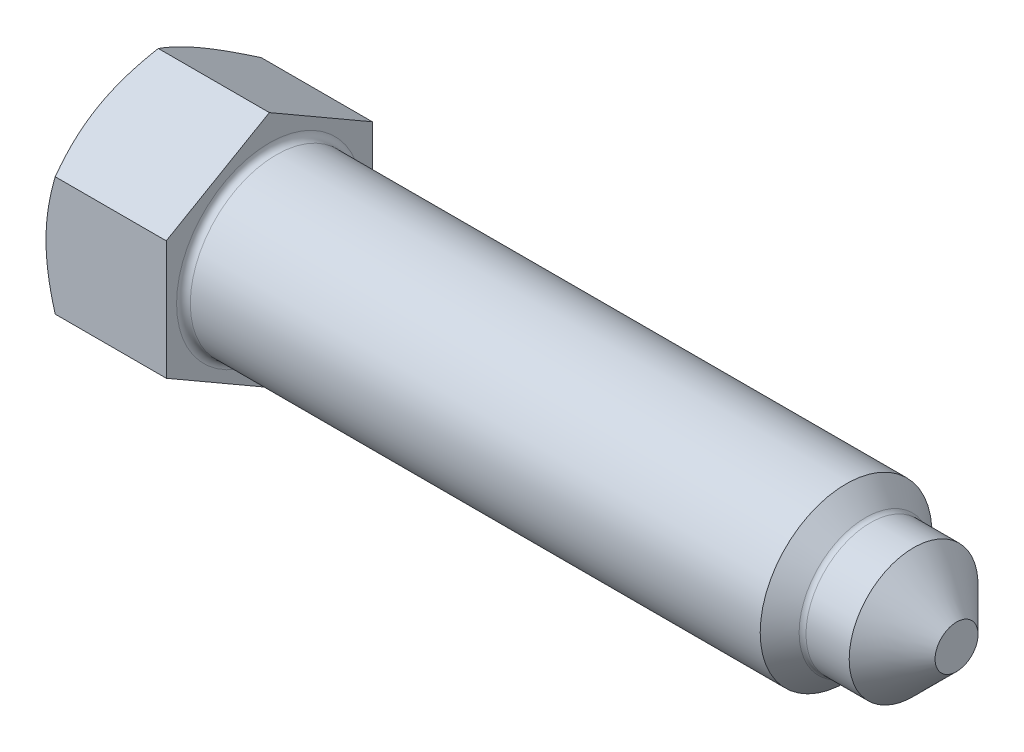
ISO-10303-21;
HEADER;
FILE_DESCRIPTION(('STEP AP214'),'2;1');
FILE_NAME('part.step','',(''),(''),'','','');
FILE_SCHEMA(('AUTOMOTIVE_DESIGN { 1 0 10303 214 1 1 1 1 }'));
ENDSEC;
DATA;
#1=APPLICATION_CONTEXT('core data for automotive mechanical design processes');
#2=APPLICATION_PROTOCOL_DEFINITION('international standard','automotive_design',2000,#1);
#3=PRODUCT_CONTEXT('',#1,'mechanical');
#4=PRODUCT('Part','Part','',(#3));
#5=PRODUCT_RELATED_PRODUCT_CATEGORY('part','',(#4));
#6=PRODUCT_DEFINITION_FORMATION('','',#4);
#7=PRODUCT_DEFINITION_CONTEXT('part definition',#1,'design');
#8=PRODUCT_DEFINITION('design','',#6,#7);
#9=PRODUCT_DEFINITION_SHAPE('','',#8);
#10=(LENGTH_UNIT() NAMED_UNIT(*) SI_UNIT(.MILLI.,.METRE.));
#11=(NAMED_UNIT(*) PLANE_ANGLE_UNIT() SI_UNIT($,.RADIAN.));
#12=(NAMED_UNIT(*) SI_UNIT($,.STERADIAN.) SOLID_ANGLE_UNIT());
#13=UNCERTAINTY_MEASURE_WITH_UNIT(LENGTH_MEASURE(1.E-05),#10,'distance_accuracy_value','');
#14=(GEOMETRIC_REPRESENTATION_CONTEXT(3) GLOBAL_UNCERTAINTY_ASSIGNED_CONTEXT((#13)) GLOBAL_UNIT_ASSIGNED_CONTEXT((#10,
#11,#12)) REPRESENTATION_CONTEXT('',''));
#15=CARTESIAN_POINT('',(0.,0.,0.));
#16=DIRECTION('',(0.,0.,1.));
#17=DIRECTION('',(1.,0.,0.));
#18=AXIS2_PLACEMENT_3D('',#15,#16,#17);
#19=CARTESIAN_POINT('',(14.,6.9282032302755,-12.));
#20=DIRECTION('',(0.,-0.866025403784438,0.500000000000001));
#21=DIRECTION('',(0.,-0.500000000000001,-0.866025403784438));
#22=AXIS2_PLACEMENT_3D('',#19,#20,#21);
#23=PLANE('',#22);
#24=CARTESIAN_POINT('',(1.07186343722447,13.8565219306049,0.0002));
#25=CARTESIAN_POINT('',(0.983949632185857,13.7042251307133,-0.263585795242263));
#26=CARTESIAN_POINT('',(0.900025997556664,13.5513604901482,-0.5283551193818));
#27=CARTESIAN_POINT('',(0.741266218872839,13.244405350712,-1.06001701652966));
#28=CARTESIAN_POINT('',(0.666433063673581,13.0903144663124,-1.32691025729307));
#29=CARTESIAN_POINT('',(0.457017539854151,12.6255589607763,-2.13189040597901));
#30=CARTESIAN_POINT('',(0.33790323672285,12.3130596590925,-2.6731550738251));
#31=CARTESIAN_POINT('',(0.198231061003145,11.8454187840152,-3.48313282915499));
#32=CARTESIAN_POINT('',(0.158443797040445,11.6916742921315,-3.74942610048137));
#33=CARTESIAN_POINT('',(0.091723369217091,11.3834734611381,-4.28324559869683));
#34=CARTESIAN_POINT('',(0.0647904527677748,11.2290171083848,-4.55077184921737));
#35=CARTESIAN_POINT('',(0.0244685919169245,10.9198468953819,-5.08627036632534));
#36=CARTESIAN_POINT('',(0.0110635528823167,10.7651335610083,-5.35424172206872));
#37=CARTESIAN_POINT('',(-0.00191690624283409,10.4555635369292,-5.89043273227403));
#38=CARTESIAN_POINT('',(-0.00149275363726694,10.3007068518009,-6.15865237880803));
#39=CARTESIAN_POINT('',(0.0122200193427709,10.011202064883,-6.6600893787841));
#40=CARTESIAN_POINT('',(0.0238359825785288,9.87653331649855,-6.89334249317775));
#41=CARTESIAN_POINT('',(0.0573080088723756,9.60750555673725,-7.35931224173076));
#42=CARTESIAN_POINT('',(0.0791647962662152,9.47314656794543,-7.59202883677176));
#43=CARTESIAN_POINT('',(0.132737416542906,9.20481134519089,-8.05679907604294));
#44=CARTESIAN_POINT('',(0.16446139249292,9.07083551994084,-8.288852012362));
#45=CARTESIAN_POINT('',(0.237211775670436,8.80351197901488,-8.75186996730497));
#46=CARTESIAN_POINT('',(0.278238815183194,8.67016430666066,-8.98283491089354));
#47=CARTESIAN_POINT('',(0.416311653281799,8.2653799638421,-9.68394195876366));
#48=CARTESIAN_POINT('',(0.52712488833932,7.99511549730955,-10.1520537462785));
#49=CARTESIAN_POINT('',(0.778625766937874,7.45861659251288,-11.0812971075914));
#50=CARTESIAN_POINT('',(0.919254342659372,7.19237528499142,-11.5424405792922));
#51=CARTESIAN_POINT('',(1.07186343722446,6.92808776022166,-12.0002));
#52=B_SPLINE_CURVE_WITH_KNOTS('',3,(#24,#25,#26,#27,#28,#29,#30,#31,#32,#33,#34,#35,#36,#37,#38,
#39,#40,#41,#42,#43,#44,#45,#46,#47,#48,#49,#50,#51),.UNSPECIFIED.,.F.,.F.,(4,2,2,2,2,2,2,2,2,2,
2,2,2,4),(0.,0.951004872251244,1.90232158356437,3.80900466161368,4.7389455141357,
5.66890426477609,6.59775529889865,7.5265776327693,8.33514643820578,9.14377244252749,
9.95306755799765,10.7624176939264,12.4167102786892,14.0677556316691),.UNSPECIFIED.);
#53=CARTESIAN_POINT('',(1.07179676972448,13.856406460551,0.));
#54=VERTEX_POINT('',#53);
#55=CARTESIAN_POINT('',(0.,10.3923048454133,-6.00000000000002));
#56=VERTEX_POINT('',#55);
#57=EDGE_CURVE('E47',#54,#56,#52,.T.);
#58=ORIENTED_EDGE('',*,*,#57,.F.);
#59=DIRECTION('',(-1.,0.,0.));
#60=VECTOR('',#59,1.);
#61=CARTESIAN_POINT('',(14.,13.856406460551,0.));
#62=LINE('',#61,#60);
#63=CARTESIAN_POINT('',(14.,13.856406460551,0.));
#64=VERTEX_POINT('',#63);
#65=EDGE_CURVE('E146',#64,#54,#62,.T.);
#66=ORIENTED_EDGE('',*,*,#65,.F.);
#67=DIRECTION('',(0.,0.500000000000001,0.866025403784438));
#68=VECTOR('',#67,1.);
#69=CARTESIAN_POINT('',(14.,6.9282032302755,-12.));
#70=LINE('',#69,#68);
#71=CARTESIAN_POINT('',(14.,6.9282032302755,-12.));
#72=VERTEX_POINT('',#71);
#73=EDGE_CURVE('E306',#72,#64,#70,.T.);
#74=ORIENTED_EDGE('',*,*,#73,.F.);
#75=DIRECTION('',(-1.,0.,0.));
#76=VECTOR('',#75,1.);
#77=CARTESIAN_POINT('',(14.,6.9282032302755,-12.));
#78=LINE('',#77,#76);
#79=CARTESIAN_POINT('',(1.07179676972447,6.9282032302755,-12.));
#80=VERTEX_POINT('',#79);
#81=EDGE_CURVE('E133',#72,#80,#78,.T.);
#82=ORIENTED_EDGE('',*,*,#81,.T.);
#83=EDGE_CURVE('E127',#56,#80,#52,.T.);
#84=ORIENTED_EDGE('',*,*,#83,.F.);
#85=EDGE_LOOP('',(#58,#66,#74,#82,#84));
#86=FACE_BOUND('',#85,.T.);
#87=ADVANCED_FACE('F32',(#86),#23,.F.);
#88=CARTESIAN_POINT('',(14.,13.856406460551,0.));
#89=DIRECTION('',(0.,-0.866025403784439,-0.5));
#90=DIRECTION('',(0.,0.5,-0.866025403784439));
#91=AXIS2_PLACEMENT_3D('',#88,#89,#90);
#92=PLANE('',#91);
#93=CARTESIAN_POINT('',(1.07186343722447,6.92808776022168,12.0002));
#94=CARTESIAN_POINT('',(0.983949632185856,7.0803845601132,11.7364142047577));
#95=CARTESIAN_POINT('',(0.900025997556663,7.23324920067831,11.4716448806182));
#96=CARTESIAN_POINT('',(0.741266218872838,7.5402043401145,10.9399829834703));
#97=CARTESIAN_POINT('',(0.666433063673581,7.69429522451415,10.6730897427069));
#98=CARTESIAN_POINT('',(0.457017539854151,8.15905073005028,9.86810959402099));
#99=CARTESIAN_POINT('',(0.337903236722851,8.47155003173405,9.3268449261749));
#100=CARTESIAN_POINT('',(0.198231061003146,8.93919090681138,8.51686717084501));
#101=CARTESIAN_POINT('',(0.158443797040447,9.09293539869505,8.25057389951863));
#102=CARTESIAN_POINT('',(0.0917233692170934,9.40113622968842,7.71675440130316));
#103=CARTESIAN_POINT('',(0.0647904527677778,9.55559258244174,7.44922815078262));
#104=CARTESIAN_POINT('',(0.024468591916929,9.86476279544467,6.91372963367465));
#105=CARTESIAN_POINT('',(0.0110635528823219,10.0194761298182,6.64575827793128));
#106=CARTESIAN_POINT('',(-0.00191690624282825,10.3290461538973,6.10956726772596));
#107=CARTESIAN_POINT('',(-0.00149275363726122,10.4839028390257,5.84134762119196));
#108=CARTESIAN_POINT('',(0.0122200193427771,10.7734076259435,5.3399106212159));
#109=CARTESIAN_POINT('',(0.0238359825785356,10.908076374328,5.10665750682225));
#110=CARTESIAN_POINT('',(0.057308008872383,11.1771041340893,4.64068775826924));
#111=CARTESIAN_POINT('',(0.0791647962662228,11.3114631228811,4.40797116322823));
#112=CARTESIAN_POINT('',(0.132737416542915,11.5797983456356,3.94320092395706));
#113=CARTESIAN_POINT('',(0.164461392492929,11.7137741708857,3.711147987638));
#114=CARTESIAN_POINT('',(0.237211775670445,11.9810977118116,3.24813003269502));
#115=CARTESIAN_POINT('',(0.278238815183202,12.1144453841659,3.01716508910646));
#116=CARTESIAN_POINT('',(0.416311653281805,12.5192297269844,2.31605804123633));
#117=CARTESIAN_POINT('',(0.527124888339327,12.789494193517,1.84794625372147));
#118=CARTESIAN_POINT('',(0.778625766937884,13.3259930983136,0.91870289240858));
#119=CARTESIAN_POINT('',(0.919254342659383,13.5922344058351,0.457559420707848));
#120=CARTESIAN_POINT('',(1.07186343722447,13.8565219306049,-0.000199999999998182));
#121=B_SPLINE_CURVE_WITH_KNOTS('',3,(#93,#94,#95,#96,#97,#98,#99,#100,#101,#102,#103,#104,#105,
#106,#107,#108,#109,#110,#111,#112,#113,#114,#115,#116,#117,#118,#119,#120),.UNSPECIFIED.,.F.,
.F.,(4,2,2,2,2,2,2,2,2,2,2,2,2,4),(0.,0.951004872251244,1.90232158356437,3.80900466161368,
4.7389455141357,5.66890426477609,6.59775529889865,7.5265776327693,8.33514643820578,
9.14377244252749,9.95306755799765,10.7624176939264,12.4167102786892,14.0677556316691),.UNSPECIFIED.);
#122=CARTESIAN_POINT('',(1.07179676972448,6.92820323027552,12.));
#123=VERTEX_POINT('',#122);
#124=CARTESIAN_POINT('',(0.,10.3923048454133,6.));
#125=VERTEX_POINT('',#124);
#126=EDGE_CURVE('E55',#123,#125,#121,.T.);
#127=ORIENTED_EDGE('',*,*,#126,.F.);
#128=DIRECTION('',(-1.,0.,0.));
#129=VECTOR('',#128,1.);
#130=CARTESIAN_POINT('',(14.,6.92820323027552,12.));
#131=LINE('',#130,#129);
#132=CARTESIAN_POINT('',(14.,6.92820323027552,12.));
#133=VERTEX_POINT('',#132);
#134=EDGE_CURVE('E143',#133,#123,#131,.T.);
#135=ORIENTED_EDGE('',*,*,#134,.F.);
#136=DIRECTION('',(0.,-0.5,0.866025403784439));
#137=VECTOR('',#136,1.);
#138=CARTESIAN_POINT('',(14.,13.856406460551,0.));
#139=LINE('',#138,#137);
#140=EDGE_CURVE('E292',#64,#133,#139,.T.);
#141=ORIENTED_EDGE('',*,*,#140,.F.);
#142=ORIENTED_EDGE('',*,*,#65,.T.);
#143=EDGE_CURVE('E221',#125,#54,#121,.T.);
#144=ORIENTED_EDGE('',*,*,#143,.F.);
#145=EDGE_LOOP('',(#127,#135,#141,#142,#144));
#146=FACE_BOUND('',#145,.T.);
#147=ADVANCED_FACE('F173',(#146),#92,.F.);
#148=CARTESIAN_POINT('',(14.,6.92820323027552,12.));
#149=DIRECTION('',(0.,0.,-1.));
#150=DIRECTION('',(-1.,0.,0.));
#151=AXIS2_PLACEMENT_3D('',#148,#149,#150);
#152=PLANE('',#151);
#153=CARTESIAN_POINT('',(5.93796522499153,-18.7780422876809,12.));
#154=CARTESIAN_POINT('',(5.81013580153164,-18.5152821742341,12.));
#155=CARTESIAN_POINT('',(5.68293119845558,-18.2522182359297,12.));
#156=CARTESIAN_POINT('',(5.4299128141003,-17.7254193681017,12.));
#157=CARTESIAN_POINT('',(5.30409904630049,-17.4616844321054,12.));
#158=CARTESIAN_POINT('',(4.92892368290869,-16.6693101743881,12.));
#159=CARTESIAN_POINT('',(4.68186469152989,-16.1395765656331,12.));
#160=CARTESIAN_POINT('',(4.19405479952977,-15.0738169190077,12.));
#161=CARTESIAN_POINT('',(3.95334413341021,-14.5377724221017,12.));
#162=CARTESIAN_POINT('',(3.48154718674619,-13.461479060208,12.));
#163=CARTESIAN_POINT('',(3.25046046260961,-12.9212303903669,12.));
#164=CARTESIAN_POINT('',(2.79294900667125,-11.8175688689819,12.));
#165=CARTESIAN_POINT('',(2.56693655895498,-11.2539842320577,12.));
#166=CARTESIAN_POINT('',(2.1316128327316,-10.1202797331247,12.));
#167=CARTESIAN_POINT('',(1.92230340506568,-9.55015915485904,12.));
#168=CARTESIAN_POINT('',(1.52576124918551,-8.40350794466344,12.));
#169=CARTESIAN_POINT('',(1.33848523718243,-7.82699240007885,12.));
#170=CARTESIAN_POINT('',(0.991896700180043,-6.66563869600159,12.));
#171=CARTESIAN_POINT('',(0.832575542892151,-6.08080316618916,12.));
#172=CARTESIAN_POINT('',(0.620681197025559,-5.19882791551968,12.));
#173=CARTESIAN_POINT('',(0.554713150855279,-4.90488790342144,12.));
#174=CARTESIAN_POINT('',(0.432574422995972,-4.31496880701139,12.));
#175=CARTESIAN_POINT('',(0.376403548449431,-4.01898976295722,12.));
#176=CARTESIAN_POINT('',(0.274840044165102,-3.42518449183523,12.));
#177=CARTESIAN_POINT('',(0.229447213467058,-3.12735829931438,12.));
#178=CARTESIAN_POINT('',(0.150338666864209,-2.5301603353483,12.));
#179=CARTESIAN_POINT('',(0.116622484244824,-2.23078862616277,12.));
#180=CARTESIAN_POINT('',(0.0619693201283194,-1.63489952034462,12.));
#181=CARTESIAN_POINT('',(0.0408679219512408,-1.33839729705373,12.));
#182=CARTESIAN_POINT('',(0.011231051902193,-0.744766224338106,12.));
#183=CARTESIAN_POINT('',(0.00269536679662676,-0.447637385632403,12.));
#184=CARTESIAN_POINT('',(-0.00160621157202279,0.146715096942947,12.));
#185=CARTESIAN_POINT('',(0.00262788821472256,0.443938740760907,12.));
#186=CARTESIAN_POINT('',(0.0237602868313385,1.03793867900078,12.));
#187=CARTESIAN_POINT('',(0.0406591751133814,1.33471495195668,12.));
#188=CARTESIAN_POINT('',(0.0957363037225956,2.04293812544913,12.));
#189=CARTESIAN_POINT('',(0.139644388869436,2.45394931182507,12.));
#190=CARTESIAN_POINT('',(0.249393763135937,3.27301119833397,12.));
#191=CARTESIAN_POINT('',(0.315237895547365,3.68106150767662,12.));
#192=CARTESIAN_POINT('',(0.542190666924397,4.90025554060109,12.));
#193=CARTESIAN_POINT('',(0.732681274216213,5.70600726238714,12.));
#194=CARTESIAN_POINT('',(1.06415793334629,6.9110176011861,12.));
#195=CARTESIAN_POINT('',(1.18384338751809,7.31649624625241,12.));
#196=CARTESIAN_POINT('',(1.43593551476423,8.12351840181158,12.));
#197=CARTESIAN_POINT('',(1.56834227450982,8.52506188547334,12.));
#198=CARTESIAN_POINT('',(1.84372865812762,9.32433402651673,12.));
#199=CARTESIAN_POINT('',(1.98670500371922,9.72206382387904,12.));
#200=CARTESIAN_POINT('',(2.28151949374366,10.514209106185,12.));
#201=CARTESIAN_POINT('',(2.43335751674012,10.9086246364612,12.));
#202=CARTESIAN_POINT('',(2.81137815071348,11.8636440545742,12.));
#203=CARTESIAN_POINT('',(3.04143185567878,12.4227131308579,12.));
#204=CARTESIAN_POINT('',(3.51333410611207,13.5358669332654,12.));
#205=CARTESIAN_POINT('',(3.75518348678293,14.0899513031432,12.));
#206=CARTESIAN_POINT('',(4.24823475653158,15.1941025186568,12.));
#207=CARTESIAN_POINT('',(4.49943904043689,15.7441682918316,12.));
#208=CARTESIAN_POINT('',(5.00924552887372,16.840834953602,12.));
#209=CARTESIAN_POINT('',(5.26784754956298,17.38743592789,12.));
#210=CARTESIAN_POINT('',(5.79133879928481,18.4784293923003,12.));
#211=CARTESIAN_POINT('',(6.05623527465221,19.0228183989983,12.));
#212=CARTESIAN_POINT('',(6.59090796254076,20.1091945794084,12.));
#213=CARTESIAN_POINT('',(6.86068419945744,20.651181741096,12.));
#214=CARTESIAN_POINT('',(7.40421496208663,21.7330545936329,12.));
#215=CARTESIAN_POINT('',(7.67796889125698,22.2729405845112,12.));
#216=CARTESIAN_POINT('',(8.22882461462081,23.351002874205,12.));
#217=CARTESIAN_POINT('',(8.50592642242825,23.8891791660569,12.));
#218=CARTESIAN_POINT('',(9.29226596146121,25.4066579940568,12.));
#219=CARTESIAN_POINT('',(9.8047565962353,26.3842748096139,12.));
#220=CARTESIAN_POINT('',(10.8366490575023,28.3358962609435,12.));
#221=CARTESIAN_POINT('',(11.3560511647271,29.3099007479223,12.));
#222=CARTESIAN_POINT('',(12.3986980712295,31.2524398572293,12.));
#223=CARTESIAN_POINT('',(12.9219285874181,32.2209821512088,12.));
#224=CARTESIAN_POINT('',(13.709817261168,33.6721037842398,12.));
#225=CARTESIAN_POINT('',(13.9729461083085,34.1555146940214,12.));
#226=CARTESIAN_POINT('',(14.5001155834575,35.1218381868037,12.));
#227=CARTESIAN_POINT('',(14.7641562100751,35.6047507705632,12.));
#228=CARTESIAN_POINT('',(15.0285993289472,36.087442911269,12.));
#229=B_SPLINE_CURVE_WITH_KNOTS('',3,(#153,#154,#155,#156,#157,#158,#159,#160,#161,#162,#163,
#164,#165,#166,#167,#168,#169,#170,#171,#172,#173,#174,#175,#176,#177,#178,#179,#180,#181,#182,
#183,#184,#185,#186,#187,#188,#189,#190,#191,#192,#193,#194,#195,#196,#197,#198,#199,#200,#201,
#202,#203,#204,#205,#206,#207,#208,#209,#210,#211,#212,#213,#214,#215,#216,#217,#218,#219,#220,
#221,#222,#223,#224,#225,#226,#227,#228),.UNSPECIFIED.,.F.,.F.,(4,2,2,2,2,2,2,2,2,2,2,2,2,2,2,2,
2,2,2,2,2,2,2,2,2,2,2,2,2,2,2,2,2,2,2,2,2,4),(0.,0.876610778943412,1.75323004620523,
3.50671945197806,5.26947518067904,7.03214956933032,8.85359042595664,10.6752328347611,
12.4932347351832,14.3106742559303,15.2142921518805,16.117892258087,17.0214755150421,
17.9250226516858,18.8165208716869,19.7080039632538,20.5994865696161,21.4910106704728,
22.7303633484054,23.9698767304575,26.4502079763428,27.7184187234137,28.9866381115162,
30.2544657836992,31.5222760862276,33.3357454112636,35.1493433274816,36.9634087547281,
38.7774291394607,40.5936500751824,42.4098800933003,44.2258404831105,46.0418082599001,
49.3531754129826,52.664677481008,55.9671781132062,57.6183303465534,59.2694800621133),.UNSPECIFIED.);
#230=CARTESIAN_POINT('',(1.07179676972447,-6.92820323027549,12.));
#231=VERTEX_POINT('',#230);
#232=CARTESIAN_POINT('',(0.,0.,12.));
#233=VERTEX_POINT('',#232);
#234=EDGE_CURVE('E230',#231,#233,#229,.T.);
#235=ORIENTED_EDGE('',*,*,#234,.F.);
#236=DIRECTION('',(-1.,0.,0.));
#237=VECTOR('',#236,1.);
#238=CARTESIAN_POINT('',(14.,-6.92820323027549,12.));
#239=LINE('',#238,#237);
#240=CARTESIAN_POINT('',(14.,-6.92820323027549,12.));
#241=VERTEX_POINT('',#240);
#242=EDGE_CURVE('E135',#241,#231,#239,.T.);
#243=ORIENTED_EDGE('',*,*,#242,.F.);
#244=DIRECTION('',(0.,-1.,0.));
#245=VECTOR('',#244,1.);
#246=CARTESIAN_POINT('',(14.,6.92820323027552,12.));
#247=LINE('',#246,#245);
#248=EDGE_CURVE('E291',#133,#241,#247,.T.);
#249=ORIENTED_EDGE('',*,*,#248,.F.);
#250=ORIENTED_EDGE('',*,*,#134,.T.);
#251=EDGE_CURVE('E225',#233,#123,#229,.T.);
#252=ORIENTED_EDGE('',*,*,#251,.F.);
#253=EDGE_LOOP('',(#235,#243,#249,#250,#252));
#254=FACE_BOUND('',#253,.T.);
#255=ADVANCED_FACE('F179',(#254),#152,.F.);
#256=CARTESIAN_POINT('',(14.,-13.856406460551,0.));
#257=DIRECTION('',(0.,0.866025403784437,-0.500000000000002));
#258=DIRECTION('',(0.,0.500000000000002,0.866025403784437));
#259=AXIS2_PLACEMENT_3D('',#256,#257,#258);
#260=PLANE('',#259);
#261=CARTESIAN_POINT('',(1.07186343722448,-13.8565219306049,-0.000200000000000038));
#262=CARTESIAN_POINT('',(0.983949632185864,-13.7042251307134,0.263585795242262));
#263=CARTESIAN_POINT('',(0.900025997556671,-13.5513604901482,0.528355119381799));
#264=CARTESIAN_POINT('',(0.741266218872846,-13.2444053507121,1.06001701652966));
#265=CARTESIAN_POINT('',(0.666433063673588,-13.0903144663124,1.32691025729307));
#266=CARTESIAN_POINT('',(0.457017539854158,-12.6255589607763,2.13189040597901));
#267=CARTESIAN_POINT('',(0.337903236722855,-12.3130596590925,2.6731550738251));
#268=CARTESIAN_POINT('',(0.198231061003148,-11.8454187840152,3.48313282915499));
#269=CARTESIAN_POINT('',(0.158443797040449,-11.6916742921315,3.74942610048137));
#270=CARTESIAN_POINT('',(0.0917233692170945,-11.3834734611381,4.28324559869684));
#271=CARTESIAN_POINT('',(0.0647904527677789,-11.2290171083848,4.55077184921738));
#272=CARTESIAN_POINT('',(0.0244685919169284,-10.9198468953819,5.08627036632535));
#273=CARTESIAN_POINT('',(0.0110635528823198,-10.7651335610083,5.35424172206872));
#274=CARTESIAN_POINT('',(-0.00191690624283167,-10.4555635369292,5.89043273227403));
#275=CARTESIAN_POINT('',(-0.0014927536372644,-10.3007068518009,6.15865237880803));
#276=CARTESIAN_POINT('',(0.0122200193427734,-10.0112020648831,6.6600893787841));
#277=CARTESIAN_POINT('',(0.0238359825785312,-9.87653331649856,6.89334249317775));
#278=CARTESIAN_POINT('',(0.0573080088723783,-9.60750555673725,7.35931224173077));
#279=CARTESIAN_POINT('',(0.0791647962662184,-9.47314656794544,7.59202883677177));
#280=CARTESIAN_POINT('',(0.132737416542909,-9.2048113451909,8.05679907604294));
#281=CARTESIAN_POINT('',(0.164461392492923,-9.07083551994084,8.288852012362));
#282=CARTESIAN_POINT('',(0.237211775670439,-8.80351197901488,8.75186996730498));
#283=CARTESIAN_POINT('',(0.278238815183195,-8.67016430666066,8.98283491089354));
#284=CARTESIAN_POINT('',(0.416311653281799,-8.2653799638421,9.68394195876367));
#285=CARTESIAN_POINT('',(0.52712488833932,-7.99511549730955,10.1520537462785));
#286=CARTESIAN_POINT('',(0.778625766937875,-7.45861659251288,11.0812971075914));
#287=CARTESIAN_POINT('',(0.919254342659373,-7.19237528499142,11.5424405792922));
#288=CARTESIAN_POINT('',(1.07186343722446,-6.92808776022166,12.0002));
#289=B_SPLINE_CURVE_WITH_KNOTS('',3,(#261,#262,#263,#264,#265,#266,#267,#268,#269,#270,#271,
#272,#273,#274,#275,#276,#277,#278,#279,#280,#281,#282,#283,#284,#285,#286,#287,#288),
.UNSPECIFIED.,.F.,.F.,(4,2,2,2,2,2,2,2,2,2,2,2,2,4),(0.,0.951004872251247,1.90232158356438,
3.80900466161369,4.7389455141357,5.66890426477609,6.59775529889866,7.52657763276931,
8.33514643820579,9.1437724425275,9.95306755799766,10.7624176939264,12.4167102786892,
14.0677556316691),.UNSPECIFIED.);
#290=CARTESIAN_POINT('',(1.07179676972449,-13.856406460551,0.));
#291=VERTEX_POINT('',#290);
#292=CARTESIAN_POINT('',(0.,-10.3923048454132,6.00000000000002));
#293=VERTEX_POINT('',#292);
#294=EDGE_CURVE('E195',#291,#293,#289,.T.);
#295=ORIENTED_EDGE('',*,*,#294,.F.);
#296=DIRECTION('',(-1.,0.,0.));
#297=VECTOR('',#296,1.);
#298=CARTESIAN_POINT('',(14.,-13.856406460551,0.));
#299=LINE('',#298,#297);
#300=CARTESIAN_POINT('',(14.,-13.856406460551,0.));
#301=VERTEX_POINT('',#300);
#302=EDGE_CURVE('E132',#301,#291,#299,.T.);
#303=ORIENTED_EDGE('',*,*,#302,.F.);
#304=DIRECTION('',(0.,-0.500000000000002,-0.866025403784437));
#305=VECTOR('',#304,1.);
#306=CARTESIAN_POINT('',(14.,-13.856406460551,0.));
#307=LINE('',#306,#305);
#308=EDGE_CURVE('E300',#241,#301,#307,.T.);
#309=ORIENTED_EDGE('',*,*,#308,.F.);
#310=ORIENTED_EDGE('',*,*,#242,.T.);
#311=EDGE_CURVE('E231',#293,#231,#289,.T.);
#312=ORIENTED_EDGE('',*,*,#311,.F.);
#313=EDGE_LOOP('',(#295,#303,#309,#310,#312));
#314=FACE_BOUND('',#313,.T.);
#315=ADVANCED_FACE('F236',(#314),#260,.F.);
#316=CARTESIAN_POINT('',(14.,-6.92820323027553,-12.));
#317=DIRECTION('',(0.,0.866025403784438,0.5));
#318=DIRECTION('',(0.,-0.5,0.866025403784439));
#319=AXIS2_PLACEMENT_3D('',#316,#317,#318);
#320=PLANE('',#319);
#321=CARTESIAN_POINT('',(1.07186343722447,-6.92808776022169,-12.0002));
#322=CARTESIAN_POINT('',(0.983949632185859,-7.08038456011321,-11.7364142047577));
#323=CARTESIAN_POINT('',(0.900025997556666,-7.23324920067832,-11.4716448806182));
#324=CARTESIAN_POINT('',(0.741266218872841,-7.54020434011451,-10.9399829834703));
#325=CARTESIAN_POINT('',(0.666433063673584,-7.69429522451416,-10.6730897427069));
#326=CARTESIAN_POINT('',(0.457017539854154,-8.15905073005029,-9.86810959402099));
#327=CARTESIAN_POINT('',(0.337903236722854,-8.47155003173406,-9.3268449261749));
#328=CARTESIAN_POINT('',(0.198231061003151,-8.93919090681139,-8.516867170845));
#329=CARTESIAN_POINT('',(0.158443797040452,-9.09293539869506,-8.25057389951863));
#330=CARTESIAN_POINT('',(0.0917233692170985,-9.40113622968843,-7.71675440130316));
#331=CARTESIAN_POINT('',(0.0647904527677828,-9.55559258244175,-7.44922815078262));
#332=CARTESIAN_POINT('',(0.024468591916934,-9.86476279544469,-6.91372963367465));
#333=CARTESIAN_POINT('',(0.011063552882327,-10.0194761298182,-6.64575827793127));
#334=CARTESIAN_POINT('',(-0.00191690624282283,-10.3290461538973,-6.10956726772596));
#335=CARTESIAN_POINT('',(-0.00149275363725555,-10.4839028390257,-5.84134762119196));
#336=CARTESIAN_POINT('',(0.0122200193427835,-10.7734076259435,-5.3399106212159));
#337=CARTESIAN_POINT('',(0.0238359825785423,-10.908076374328,-5.10665750682225));
#338=CARTESIAN_POINT('',(0.0573080088723902,-11.1771041340893,-4.64068775826923));
#339=CARTESIAN_POINT('',(0.07916479626623,-11.3114631228811,-4.40797116322823));
#340=CARTESIAN_POINT('',(0.132737416542921,-11.5797983456357,-3.94320092395706));
#341=CARTESIAN_POINT('',(0.164461392492935,-11.7137741708857,-3.711147987638));
#342=CARTESIAN_POINT('',(0.237211775670452,-11.9810977118117,-3.24813003269502));
#343=CARTESIAN_POINT('',(0.278238815183209,-12.1144453841659,-3.01716508910646));
#344=CARTESIAN_POINT('',(0.416311653281813,-12.5192297269844,-2.31605804123633));
#345=CARTESIAN_POINT('',(0.527124888339336,-12.789494193517,-1.84794625372147));
#346=CARTESIAN_POINT('',(0.778625766937892,-13.3259930983137,-0.918702892408578));
#347=CARTESIAN_POINT('',(0.91925434265939,-13.5922344058351,-0.457559420707847));
#348=CARTESIAN_POINT('',(1.07186343722448,-13.8565219306049,0.000199999999998666));
#349=B_SPLINE_CURVE_WITH_KNOTS('',3,(#321,#322,#323,#324,#325,#326,#327,#328,#329,#330,#331,
#332,#333,#334,#335,#336,#337,#338,#339,#340,#341,#342,#343,#344,#345,#346,#347,#348),
.UNSPECIFIED.,.F.,.F.,(4,2,2,2,2,2,2,2,2,2,2,2,2,4),(0.,0.951004872251244,1.90232158356437,
3.80900466161368,4.7389455141357,5.66890426477609,6.59775529889865,7.5265776327693,
8.33514643820578,9.14377244252749,9.95306755799765,10.7624176939264,12.4167102786892,
14.0677556316691),.UNSPECIFIED.);
#350=CARTESIAN_POINT('',(1.07179676972448,-6.92820323027553,-12.));
#351=VERTEX_POINT('',#350);
#352=CARTESIAN_POINT('',(0.,-10.3923048454133,-6.));
#353=VERTEX_POINT('',#352);
#354=EDGE_CURVE('E108',#351,#353,#349,.T.);
#355=ORIENTED_EDGE('',*,*,#354,.F.);
#356=DIRECTION('',(-1.,0.,0.));
#357=VECTOR('',#356,1.);
#358=CARTESIAN_POINT('',(14.,-6.92820323027553,-12.));
#359=LINE('',#358,#357);
#360=CARTESIAN_POINT('',(14.,-6.92820323027553,-12.));
#361=VERTEX_POINT('',#360);
#362=EDGE_CURVE('E123',#361,#351,#359,.T.);
#363=ORIENTED_EDGE('',*,*,#362,.F.);
#364=DIRECTION('',(0.,0.5,-0.866025403784439));
#365=VECTOR('',#364,1.);
#366=CARTESIAN_POINT('',(14.,-6.92820323027553,-12.));
#367=LINE('',#366,#365);
#368=EDGE_CURVE('E298',#301,#361,#367,.T.);
#369=ORIENTED_EDGE('',*,*,#368,.F.);
#370=ORIENTED_EDGE('',*,*,#302,.T.);
#371=EDGE_CURVE('E126',#353,#291,#349,.T.);
#372=ORIENTED_EDGE('',*,*,#371,.F.);
#373=EDGE_LOOP('',(#355,#363,#369,#370,#372));
#374=FACE_BOUND('',#373,.T.);
#375=ADVANCED_FACE('F121',(#374),#320,.F.);
#376=CARTESIAN_POINT('',(14.,6.9282032302755,-12.));
#377=DIRECTION('',(0.,0.,1.));
#378=DIRECTION('',(0.,-1.,0.));
#379=AXIS2_PLACEMENT_3D('',#376,#377,#378);
#380=PLANE('',#379);
#381=CARTESIAN_POINT('',(5.93796522688048,-18.7780422915637,-12.));
#382=CARTESIAN_POINT('',(5.81013580338117,-18.5152821780516,-12.));
#383=CARTESIAN_POINT('',(5.68293120026572,-18.2522182396819,-12.));
#384=CARTESIAN_POINT('',(5.42991281583172,-17.7254193717232,-12.));
#385=CARTESIAN_POINT('',(5.30409904799258,-17.4616844356616,-12.));
#386=CARTESIAN_POINT('',(4.92892368448291,-16.669310177748,-12.));
#387=CARTESIAN_POINT('',(4.68186469302572,-16.139576568862,-12.));
#388=CARTESIAN_POINT('',(4.19405480086876,-15.0738169219725,-12.));
#389=CARTESIAN_POINT('',(3.95334413467078,-14.5377724249334,-12.));
#390=CARTESIAN_POINT('',(3.48154718785119,-13.4614790627728,-12.));
#391=CARTESIAN_POINT('',(3.25046046363748,-12.9212303927976,-12.));
#392=CARTESIAN_POINT('',(2.7929490075426,-11.8175688711343,-12.));
#393=CARTESIAN_POINT('',(2.56693655974712,-11.2539842340656,-12.));
#394=CARTESIAN_POINT('',(2.13161283336956,-10.1202797348412,-12.));
#395=CARTESIAN_POINT('',(1.92230340562866,-9.55015915642869,-12.));
#396=CARTESIAN_POINT('',(1.52576124960571,-8.40350794593667,-12.));
#397=CARTESIAN_POINT('',(1.33848523753482,-7.82699240120253,-12.));
#398=CARTESIAN_POINT('',(0.991896700407868,-6.66563869682203,-12.));
#399=CARTESIAN_POINT('',(0.83257554306322,-6.08080316685593,-12.));
#400=CARTESIAN_POINT('',(0.620681197115221,-5.19882791591538,-12.));
#401=CARTESIAN_POINT('',(0.554713150915097,-4.90488790370126,-12.));
#402=CARTESIAN_POINT('',(0.432574423003697,-4.3149688070578,-12.));
#403=CARTESIAN_POINT('',(0.376403548434908,-4.01898976288609,-12.));
#404=CARTESIAN_POINT('',(0.274840044114867,-3.42518449152774,-12.));
#405=CARTESIAN_POINT('',(0.229447213403355,-3.12735829888806,-12.));
#406=CARTESIAN_POINT('',(0.150338666783349,-2.53016033468332,-12.));
#407=CARTESIAN_POINT('',(0.116622484160274,-2.23078862537795,-12.));
#408=CARTESIAN_POINT('',(0.0619693200469847,-1.63489951932263,-12.));
#409=CARTESIAN_POINT('',(0.040867921876617,-1.33839729591442,-12.));
#410=CARTESIAN_POINT('',(0.0112310518513523,-0.744766222964399,-12.));
#411=CARTESIAN_POINT('',(0.00269536676285804,-0.447637384141611,-12.));
#412=CARTESIAN_POINT('',(-0.00160621156152653,0.146715098667033,-12.));
#413=CARTESIAN_POINT('',(0.00262788825241379,0.443938742601202,-12.));
#414=CARTESIAN_POINT('',(0.0237602869328196,1.03793868107198,-12.));
#415=CARTESIAN_POINT('',(0.0406591752514585,1.33471495414257,-12.));
#416=CARTESIAN_POINT('',(0.0957363039506862,2.04293812781233,-12.));
#417=CARTESIAN_POINT('',(0.139644389149357,2.45394931425036,-12.));
#418=CARTESIAN_POINT('',(0.249393763522293,3.27301120088065,-12.));
#419=CARTESIAN_POINT('',(0.315237895988329,3.68106151028259,-12.));
#420=CARTESIAN_POINT('',(0.542190667530327,4.90025554338171,-12.));
#421=CARTESIAN_POINT('',(0.732681274933577,5.70600726527964,-12.));
#422=CARTESIAN_POINT('',(1.06415793422806,6.91101760424588,-12.));
#423=CARTESIAN_POINT('',(1.18384338845501,7.3164962493691,-12.));
#424=CARTESIAN_POINT('',(1.43593551580978,8.12351840504145,-12.));
#425=CARTESIAN_POINT('',(1.56834227560885,8.52506188875948,-12.));
#426=CARTESIAN_POINT('',(1.8437286593317,9.32433402991501,-12.));
#427=CARTESIAN_POINT('',(1.98670500497486,9.72206382733319,-12.));
#428=CARTESIAN_POINT('',(2.28151949510066,10.5142091097509,-12.));
#429=CARTESIAN_POINT('',(2.43335751814691,10.9086246400829,-12.));
#430=CARTESIAN_POINT('',(2.81137815220014,11.863644058233,-12.));
#431=CARTESIAN_POINT('',(3.04143185719198,12.422713134499,-12.));
#432=CARTESIAN_POINT('',(3.51333410767187,13.5358669368732,-12.));
#433=CARTESIAN_POINT('',(3.7551834883628,14.0899513067354,-12.));
#434=CARTESIAN_POINT('',(4.24823475814662,15.1941025222193,-12.));
#435=CARTESIAN_POINT('',(4.49943904206706,15.7441682953802,-12.));
#436=CARTESIAN_POINT('',(5.00924553053046,16.8408349571241,-12.));
#437=CARTESIAN_POINT('',(5.26784755123117,17.3874359313996,-12.));
#438=CARTESIAN_POINT('',(5.79133880097282,18.4784293957853,-12.));
#439=CARTESIAN_POINT('',(6.05623527634858,19.0228184024714,-12.));
#440=CARTESIAN_POINT('',(6.59090796425168,20.1091945828585,-12.));
#441=CARTESIAN_POINT('',(6.86068420117455,20.6511817445351,-12.));
#442=CARTESIAN_POINT('',(7.40421496381446,21.7330545970508,-12.));
#443=CARTESIAN_POINT('',(7.67796889298933,22.2729405879189,-12.));
#444=CARTESIAN_POINT('',(8.2288246163609,23.3510028775931,-12.));
#445=CARTESIAN_POINT('',(8.50592642417155,23.8891791694355,-12.));
#446=CARTESIAN_POINT('',(9.29226596321904,25.4066579974227,-12.));
#447=CARTESIAN_POINT('',(9.80475659800335,26.3842748129772,-12.));
#448=CARTESIAN_POINT('',(10.8366490592886,28.3358962643027,-12.));
#449=CARTESIAN_POINT('',(11.3560511665214,29.3099007512799,-12.));
#450=CARTESIAN_POINT('',(12.3986980730395,31.252439860587,-12.));
#451=CARTESIAN_POINT('',(12.9219285892359,32.2209821545683,-12.));
#452=CARTESIAN_POINT('',(13.7098172629967,33.6721037876023,-12.));
#453=CARTESIAN_POINT('',(13.9729461101407,34.155514697385,-12.));
#454=CARTESIAN_POINT('',(14.5001155852965,35.1218381901696,-12.));
#455=CARTESIAN_POINT('',(14.7641562119173,35.6047507739303,-12.));
#456=CARTESIAN_POINT('',(15.0285993307926,36.0874429146373,-12.));
#457=B_SPLINE_CURVE_WITH_KNOTS('',3,(#381,#382,#383,#384,#385,#386,#387,#388,#389,#390,#391,
#392,#393,#394,#395,#396,#397,#398,#399,#400,#401,#402,#403,#404,#405,#406,#407,#408,#409,#410,
#411,#412,#413,#414,#415,#416,#417,#418,#419,#420,#421,#422,#423,#424,#425,#426,#427,#428,#429,
#430,#431,#432,#433,#434,#435,#436,#437,#438,#439,#440,#441,#442,#443,#444,#445,#446,#447,#448,
#449,#450,#451,#452,#453,#454,#455,#456),.UNSPECIFIED.,.F.,.F.,(4,2,2,2,2,2,2,2,2,2,2,2,2,2,2,2,
2,2,2,2,2,2,2,2,2,2,2,2,2,2,2,2,2,2,2,2,2,4),(0.,0.876610779171208,1.75323004666082,
3.50671945288931,5.26947518205081,7.03214957116258,8.85359042827971,10.6752328375751,
12.4932347384866,14.3106742597227,15.2142921560315,16.1178922625966,17.02147551991,
17.9250226569119,18.8165208772623,19.7080039691785,20.5994865758902,21.4910106770964,
22.7303633552307,23.9698767374844,26.4502079837738,27.7184187310554,28.9866381193685,
30.2544657917616,31.5222760945002,33.3357454195176,35.1493433357169,36.9634087629441,
38.7774291476574,40.5936500833579,42.4098801014545,44.2258404912437,46.0418082680123,
49.3531754211021,52.6646774891347,55.9671781213485,57.6183303547036,59.2694800702715),.UNSPECIFIED.);
#458=CARTESIAN_POINT('',(0.,0.,-12.));
#459=VERTEX_POINT('',#458);
#460=EDGE_CURVE('E115',#80,#459,#457,.F.);
#461=ORIENTED_EDGE('',*,*,#460,.F.);
#462=ORIENTED_EDGE('',*,*,#81,.F.);
#463=DIRECTION('',(0.,1.,0.));
#464=VECTOR('',#463,1.);
#465=CARTESIAN_POINT('',(14.,6.9282032302755,-12.));
#466=LINE('',#465,#464);
#467=EDGE_CURVE('E131',#361,#72,#466,.T.);
#468=ORIENTED_EDGE('',*,*,#467,.F.);
#469=ORIENTED_EDGE('',*,*,#362,.T.);
#470=EDGE_CURVE('E105',#459,#351,#457,.F.);
#471=ORIENTED_EDGE('',*,*,#470,.F.);
#472=EDGE_LOOP('',(#461,#462,#468,#469,#471));
#473=FACE_BOUND('',#472,.T.);
#474=ADVANCED_FACE('F129',(#473),#380,.F.);
#475=CARTESIAN_POINT('',(14.,0.,-24.));
#476=DIRECTION('',(1.,0.,0.));
#477=DIRECTION('',(0.,0.,-1.));
#478=AXIS2_PLACEMENT_3D('',#475,#476,#477);
#479=PLANE('',#478);
#480=CARTESIAN_POINT('',(14.,0.,0.));
#481=DIRECTION('',(1.,0.,0.));
#482=DIRECTION('',(0.,0.,-1.));
#483=AXIS2_PLACEMENT_3D('',#480,#481,#482);
#484=CIRCLE('',#483,10.8);
#485=CARTESIAN_POINT('',(14.,0.,-10.8));
#486=VERTEX_POINT('',#485);
#487=EDGE_CURVE('E152',#486,#486,#484,.F.);
#488=ORIENTED_EDGE('',*,*,#487,.T.);
#489=EDGE_LOOP('',(#488));
#490=FACE_BOUND('',#489,.T.);
#491=ORIENTED_EDGE('',*,*,#73,.T.);
#492=ORIENTED_EDGE('',*,*,#140,.T.);
#493=ORIENTED_EDGE('',*,*,#248,.T.);
#494=ORIENTED_EDGE('',*,*,#308,.T.);
#495=ORIENTED_EDGE('',*,*,#368,.T.);
#496=ORIENTED_EDGE('',*,*,#467,.T.);
#497=EDGE_LOOP('',(#491,#492,#493,#494,#495,#496));
#498=FACE_BOUND('',#497,.T.);
#499=ADVANCED_FACE('F246',(#490,#498),#479,.T.);
#500=CARTESIAN_POINT('',(0.,0.,0.));
#501=DIRECTION('',(-1.,0.,0.));
#502=DIRECTION('',(0.,0.,1.));
#503=AXIS2_PLACEMENT_3D('',#500,#501,#502);
#504=CYLINDRICAL_SURFACE('',#503,10.);
#505=CARTESIAN_POINT('',(14.8,0.,0.));
#506=DIRECTION('',(1.,0.,0.));
#507=DIRECTION('',(0.,0.,-1.));
#508=AXIS2_PLACEMENT_3D('',#505,#506,#507);
#509=CIRCLE('',#508,10.);
#510=CARTESIAN_POINT('',(14.8,0.,-10.));
#511=VERTEX_POINT('',#510);
#512=EDGE_CURVE('E155',#511,#511,#509,.T.);
#513=ORIENTED_EDGE('',*,*,#512,.T.);
#514=EDGE_LOOP('',(#513));
#515=FACE_BOUND('',#514,.T.);
#516=CARTESIAN_POINT('',(81.14,0.,0.));
#517=DIRECTION('',(-1.,0.,0.));
#518=DIRECTION('',(0.,0.,1.));
#519=AXIS2_PLACEMENT_3D('',#516,#517,#518);
#520=CIRCLE('',#519,10.);
#521=CARTESIAN_POINT('',(81.14,0.,10.));
#522=VERTEX_POINT('',#521);
#523=EDGE_CURVE('E276',#522,#522,#520,.T.);
#524=ORIENTED_EDGE('',*,*,#523,.T.);
#525=EDGE_LOOP('',(#524));
#526=FACE_BOUND('',#525,.T.);
#527=ADVANCED_FACE('F253',(#515,#526),#504,.T.);
#528=CARTESIAN_POINT('',(83.64,0.,0.));
#529=DIRECTION('',(-1.,0.,0.));
#530=DIRECTION('',(0.,0.,1.));
#531=AXIS2_PLACEMENT_3D('',#528,#529,#530);
#532=CONICAL_SURFACE('',#531,7.50000000000001,0.785398163397454);
#533=CARTESIAN_POINT('',(83.4056854249492,0.,0.));
#534=DIRECTION('',(-1.,0.,0.));
#535=DIRECTION('',(0.,0.,1.));
#536=AXIS2_PLACEMENT_3D('',#533,#534,#535);
#537=CIRCLE('',#536,7.73431457505078);
#538=CARTESIAN_POINT('',(83.4056854249492,0.,7.73431457505078));
#539=VERTEX_POINT('',#538);
#540=EDGE_CURVE('E40',#539,#539,#537,.T.);
#541=ORIENTED_EDGE('',*,*,#540,.T.);
#542=EDGE_LOOP('',(#541));
#543=FACE_BOUND('',#542,.T.);
#544=ORIENTED_EDGE('',*,*,#523,.F.);
#545=EDGE_LOOP('',(#544));
#546=FACE_BOUND('',#545,.T.);
#547=ADVANCED_FACE('F160',(#543,#546),#532,.T.);
#548=CARTESIAN_POINT('',(0.,0.,0.));
#549=DIRECTION('',(-1.,0.,0.));
#550=DIRECTION('',(0.,0.,1.));
#551=AXIS2_PLACEMENT_3D('',#548,#549,#550);
#552=CYLINDRICAL_SURFACE('',#551,7.50000000000001);
#553=CARTESIAN_POINT('',(83.9713708498985,0.,0.));
#554=DIRECTION('',(-1.,0.,0.));
#555=DIRECTION('',(0.,0.,1.));
#556=AXIS2_PLACEMENT_3D('',#553,#554,#555);
#557=CIRCLE('',#556,7.50000000000001);
#558=CARTESIAN_POINT('',(83.9713708498985,0.,7.50000000000001));
#559=VERTEX_POINT('',#558);
#560=EDGE_CURVE('E11',#559,#559,#557,.F.);
#561=ORIENTED_EDGE('',*,*,#560,.T.);
#562=EDGE_LOOP('',(#561));
#563=FACE_BOUND('',#562,.T.);
#564=CARTESIAN_POINT('',(89.,0.,0.));
#565=DIRECTION('',(-1.,0.,0.));
#566=DIRECTION('',(0.,0.,1.));
#567=AXIS2_PLACEMENT_3D('',#564,#565,#566);
#568=CIRCLE('',#567,7.50000000000001);
#569=CARTESIAN_POINT('',(89.,0.,7.50000000000001));
#570=VERTEX_POINT('',#569);
#571=EDGE_CURVE('E273',#570,#570,#568,.T.);
#572=ORIENTED_EDGE('',*,*,#571,.T.);
#573=EDGE_LOOP('',(#572));
#574=FACE_BOUND('',#573,.T.);
#575=ADVANCED_FACE('F260',(#563,#574),#552,.T.);
#576=CARTESIAN_POINT('',(94.,0.,0.));
#577=DIRECTION('',(-1.,0.,0.));
#578=DIRECTION('',(0.,0.,1.));
#579=AXIS2_PLACEMENT_3D('',#576,#577,#578);
#580=CONICAL_SURFACE('',#579,2.49999999999995,0.785398163397454);
#581=CARTESIAN_POINT('',(94.,0.,0.));
#582=DIRECTION('',(-1.,0.,0.));
#583=DIRECTION('',(0.,0.,1.));
#584=AXIS2_PLACEMENT_3D('',#581,#582,#583);
#585=CIRCLE('',#584,2.49999999999995);
#586=CARTESIAN_POINT('',(94.,0.,2.49999999999994));
#587=VERTEX_POINT('',#586);
#588=EDGE_CURVE('E232',#587,#587,#585,.T.);
#589=CARTESIAN_POINT('',(89.,0.,7.50000000000001));
#590=CARTESIAN_POINT('',(89.0520833333333,0.,7.44791666666667));
#591=CARTESIAN_POINT('',(89.1041666666667,0.,7.39583333333334));
#592=CARTESIAN_POINT('',(89.2083333333333,0.,7.29166666666667));
#593=CARTESIAN_POINT('',(89.2604166666667,0.,7.23958333333334));
#594=CARTESIAN_POINT('',(89.3645833333333,0.,7.13541666666667));
#595=CARTESIAN_POINT('',(89.4166666666667,0.,7.08333333333333));
#596=CARTESIAN_POINT('',(89.5208333333333,0.,6.97916666666666));
#597=CARTESIAN_POINT('',(89.5729166666667,0.,6.92708333333333));
#598=CARTESIAN_POINT('',(89.6770833333333,0.,6.82291666666666));
#599=CARTESIAN_POINT('',(89.7291666666667,0.,6.77083333333333));
#600=CARTESIAN_POINT('',(89.8333333333333,0.,6.66666666666666));
#601=CARTESIAN_POINT('',(89.8854166666667,0.,6.61458333333333));
#602=CARTESIAN_POINT('',(89.9895833333333,0.,6.51041666666666));
#603=CARTESIAN_POINT('',(90.0416666666667,0.,6.45833333333333));
#604=CARTESIAN_POINT('',(90.1458333333333,0.,6.35416666666666));
#605=CARTESIAN_POINT('',(90.1979166666667,0.,6.30208333333332));
#606=CARTESIAN_POINT('',(90.3020833333333,0.,6.19791666666665));
#607=CARTESIAN_POINT('',(90.3541666666667,0.,6.14583333333332));
#608=CARTESIAN_POINT('',(90.4583333333333,0.,6.04166666666665));
#609=CARTESIAN_POINT('',(90.5104166666667,0.,5.98958333333332));
#610=CARTESIAN_POINT('',(90.6145833333333,0.,5.88541666666665));
#611=CARTESIAN_POINT('',(90.6666666666667,0.,5.83333333333332));
#612=CARTESIAN_POINT('',(90.7708333333333,0.,5.72916666666665));
#613=CARTESIAN_POINT('',(90.8229166666667,0.,5.67708333333332));
#614=CARTESIAN_POINT('',(90.9270833333333,0.,5.57291666666665));
#615=CARTESIAN_POINT('',(90.9791666666667,0.,5.52083333333331));
#616=CARTESIAN_POINT('',(91.0833333333333,0.,5.41666666666664));
#617=CARTESIAN_POINT('',(91.1354166666667,0.,5.36458333333331));
#618=CARTESIAN_POINT('',(91.2395833333333,0.,5.26041666666664));
#619=CARTESIAN_POINT('',(91.2916666666667,0.,5.20833333333331));
#620=CARTESIAN_POINT('',(91.3958333333333,0.,5.10416666666664));
#621=CARTESIAN_POINT('',(91.4479166666667,0.,5.05208333333331));
#622=CARTESIAN_POINT('',(91.5520833333333,0.,4.94791666666664));
#623=CARTESIAN_POINT('',(91.6041666666667,0.,4.89583333333331));
#624=CARTESIAN_POINT('',(91.7083333333333,0.,4.79166666666664));
#625=CARTESIAN_POINT('',(91.7604166666667,0.,4.7395833333333));
#626=CARTESIAN_POINT('',(91.8645833333333,0.,4.63541666666663));
#627=CARTESIAN_POINT('',(91.9166666666667,0.,4.5833333333333));
#628=CARTESIAN_POINT('',(92.0208333333333,0.,4.47916666666663));
#629=CARTESIAN_POINT('',(92.0729166666667,0.,4.4270833333333));
#630=CARTESIAN_POINT('',(92.1770833333333,0.,4.32291666666663));
#631=CARTESIAN_POINT('',(92.2291666666667,0.,4.2708333333333));
#632=CARTESIAN_POINT('',(92.3333333333333,0.,4.16666666666663));
#633=CARTESIAN_POINT('',(92.3854166666667,0.,4.11458333333329));
#634=CARTESIAN_POINT('',(92.4895833333333,0.,4.01041666666663));
#635=CARTESIAN_POINT('',(92.5416666666667,0.,3.95833333333329));
#636=CARTESIAN_POINT('',(92.6458333333333,0.,3.85416666666662));
#637=CARTESIAN_POINT('',(92.6979166666667,0.,3.80208333333329));
#638=CARTESIAN_POINT('',(92.8020833333333,0.,3.69791666666662));
#639=CARTESIAN_POINT('',(92.8541666666667,0.,3.64583333333329));
#640=CARTESIAN_POINT('',(92.9583333333333,0.,3.54166666666662));
#641=CARTESIAN_POINT('',(93.0104166666667,0.,3.48958333333329));
#642=CARTESIAN_POINT('',(93.1145833333333,0.,3.38541666666662));
#643=CARTESIAN_POINT('',(93.1666666666667,0.,3.33333333333328));
#644=CARTESIAN_POINT('',(93.2708333333333,0.,3.22916666666662));
#645=CARTESIAN_POINT('',(93.3229166666667,0.,3.17708333333328));
#646=CARTESIAN_POINT('',(93.4270833333333,0.,3.07291666666662));
#647=CARTESIAN_POINT('',(93.4791666666667,0.,3.02083333333328));
#648=CARTESIAN_POINT('',(93.5833333333333,0.,2.91666666666661));
#649=CARTESIAN_POINT('',(93.6354166666667,0.,2.86458333333328));
#650=CARTESIAN_POINT('',(93.7395833333333,0.,2.76041666666661));
#651=CARTESIAN_POINT('',(93.7916666666667,0.,2.70833333333328));
#652=CARTESIAN_POINT('',(93.8958333333333,0.,2.60416666666661));
#653=CARTESIAN_POINT('',(93.9479166666667,0.,2.55208333333328));
#654=CARTESIAN_POINT('',(94.,0.,2.49999999999994));
#655=B_SPLINE_CURVE_WITH_KNOTS('',3,(#589,#590,#591,#592,#593,#594,#595,#596,#597,#598,#599,
#600,#601,#602,#603,#604,#605,#606,#607,#608,#609,#610,#611,#612,#613,#614,#615,#616,#617,#618,
#619,#620,#621,#622,#623,#624,#625,#626,#627,#628,#629,#630,#631,#632,#633,#634,#635,#636,#637,
#638,#639,#640,#641,#642,#643,#644,#645,#646,#647,#648,#649,#650,#651,#652,#653,#654),
.UNSPECIFIED.,.F.,.F.,(4,2,2,2,2,2,2,2,2,2,2,2,2,2,2,2,2,2,2,2,2,2,2,2,2,2,2,2,2,2,2,2,4),(0.,
0.220970869120805,0.4419417382416,0.662912607362396,0.883883476483201,1.104854345604,
1.32582521472479,1.54679608384559,1.76776695296638,1.98873782208719,2.20970869120798,
2.43067956032878,2.65165042944958,2.87262129857038,3.09359216769117,3.31456303681197,
3.53553390593276,3.75650477505357,3.97747564417436,4.19844651329516,4.41941738241596,
4.64038825153676,4.86135912065755,5.08232998977835,5.30330085889914,5.52427172801995,
5.74524259714074,5.96621346626154,6.18718433538234,6.40815520450314,6.62912607362393,
6.85009694274473,7.07106781186552),.UNSPECIFIED.);
#656=EDGE_CURVE('BSEAM262',#570,#587,#655,.T.);
#657=ORIENTED_EDGE('',*,*,#571,.F.);
#658=ORIENTED_EDGE('',*,*,#588,.T.);
#659=ORIENTED_EDGE('',*,*,#656,.T.);
#660=ORIENTED_EDGE('',*,*,#656,.F.);
#661=EDGE_LOOP('',(#657,#659,#658,#660));
#662=FACE_BOUND('',#661,.T.);
#663=ADVANCED_FACE('F262',(#662),#580,.T.);
#664=CARTESIAN_POINT('',(94.,0.,0.));
#665=DIRECTION('',(-1.,0.,0.));
#666=DIRECTION('',(0.,0.,1.));
#667=AXIS2_PLACEMENT_3D('',#664,#665,#666);
#668=PLANE('',#667);
#669=ORIENTED_EDGE('',*,*,#588,.F.);
#670=EDGE_LOOP('',(#669));
#671=FACE_BOUND('',#670,.T.);
#672=ADVANCED_FACE('F208',(#671),#668,.F.);
#673=CARTESIAN_POINT('',(0.,0.,0.));
#674=DIRECTION('',(1.,0.,0.));
#675=DIRECTION('',(0.,0.,-1.));
#676=AXIS2_PLACEMENT_3D('',#673,#674,#675);
#677=CONICAL_SURFACE('',#676,12.,1.0471975511966);
#678=ORIENTED_EDGE('',*,*,#354,.T.);
#679=CARTESIAN_POINT('',(0.,0.,0.));
#680=DIRECTION('',(1.,0.,0.));
#681=DIRECTION('',(0.,0.,-1.));
#682=AXIS2_PLACEMENT_3D('',#679,#680,#681);
#683=CIRCLE('',#682,12.);
#684=EDGE_CURVE('E110',#353,#459,#683,.T.);
#685=ORIENTED_EDGE('',*,*,#684,.T.);
#686=ORIENTED_EDGE('',*,*,#470,.T.);
#687=EDGE_LOOP('',(#678,#685,#686));
#688=FACE_BOUND('',#687,.T.);
#689=ADVANCED_FACE('F107',(#688),#677,.T.);
#690=ORIENTED_EDGE('',*,*,#294,.T.);
#691=EDGE_CURVE('E150',#293,#353,#683,.T.);
#692=ORIENTED_EDGE('',*,*,#691,.T.);
#693=ORIENTED_EDGE('',*,*,#371,.T.);
#694=EDGE_LOOP('',(#690,#692,#693));
#695=FACE_BOUND('',#694,.T.);
#696=ADVANCED_FACE('F206',(#695),#677,.T.);
#697=ORIENTED_EDGE('',*,*,#234,.T.);
#698=EDGE_CURVE('E280',#233,#293,#683,.T.);
#699=ORIENTED_EDGE('',*,*,#698,.T.);
#700=ORIENTED_EDGE('',*,*,#311,.T.);
#701=EDGE_LOOP('',(#697,#699,#700));
#702=FACE_BOUND('',#701,.T.);
#703=ADVANCED_FACE('F201',(#702),#677,.T.);
#704=ORIENTED_EDGE('',*,*,#251,.T.);
#705=ORIENTED_EDGE('',*,*,#126,.T.);
#706=CARTESIAN_POINT('',(0.,0.,0.));
#707=DIRECTION('',(-1.,0.,0.));
#708=DIRECTION('',(0.,0.,1.));
#709=AXIS2_PLACEMENT_3D('',#706,#707,#708);
#710=CIRCLE('',#709,12.);
#711=EDGE_CURVE('E116',#233,#125,#710,.T.);
#712=ORIENTED_EDGE('',*,*,#711,.F.);
#713=EDGE_LOOP('',(#704,#705,#712));
#714=FACE_BOUND('',#713,.T.);
#715=ADVANCED_FACE('F205',(#714),#677,.T.);
#716=ORIENTED_EDGE('',*,*,#143,.T.);
#717=ORIENTED_EDGE('',*,*,#57,.T.);
#718=EDGE_CURVE('E288',#56,#125,#683,.T.);
#719=ORIENTED_EDGE('',*,*,#718,.T.);
#720=EDGE_LOOP('',(#716,#717,#719));
#721=FACE_BOUND('',#720,.T.);
#722=ADVANCED_FACE('F315',(#721),#677,.T.);
#723=ORIENTED_EDGE('',*,*,#83,.T.);
#724=ORIENTED_EDGE('',*,*,#460,.T.);
#725=EDGE_CURVE('E151',#459,#56,#683,.T.);
#726=ORIENTED_EDGE('',*,*,#725,.T.);
#727=EDGE_LOOP('',(#723,#724,#726));
#728=FACE_BOUND('',#727,.T.);
#729=ADVANCED_FACE('F249',(#728),#677,.T.);
#730=CARTESIAN_POINT('',(0.,0.,-24.));
#731=DIRECTION('',(1.,0.,0.));
#732=DIRECTION('',(0.,0.,-1.));
#733=AXIS2_PLACEMENT_3D('',#730,#731,#732);
#734=PLANE('',#733);
#735=ORIENTED_EDGE('',*,*,#725,.F.);
#736=ORIENTED_EDGE('',*,*,#684,.F.);
#737=ORIENTED_EDGE('',*,*,#691,.F.);
#738=ORIENTED_EDGE('',*,*,#698,.F.);
#739=ORIENTED_EDGE('',*,*,#711,.T.);
#740=ORIENTED_EDGE('',*,*,#718,.F.);
#741=EDGE_LOOP('',(#735,#736,#737,#738,#739,#740));
#742=FACE_BOUND('',#741,.T.);
#743=ADVANCED_FACE('F169',(#742),#734,.F.);
#744=CARTESIAN_POINT('',(14.8,0.,0.));
#745=DIRECTION('',(1.,0.,0.));
#746=DIRECTION('',(0.,0.,-1.));
#747=AXIS2_PLACEMENT_3D('',#744,#745,#746);
#748=TOROIDAL_SURFACE('',#747,10.8,0.8);
#749=ORIENTED_EDGE('',*,*,#512,.F.);
#750=EDGE_LOOP('',(#749));
#751=FACE_BOUND('',#750,.T.);
#752=ORIENTED_EDGE('',*,*,#487,.F.);
#753=EDGE_LOOP('',(#752));
#754=FACE_BOUND('',#753,.T.);
#755=ADVANCED_FACE('F164',(#751,#754),#748,.F.);
#756=CARTESIAN_POINT('',(83.9713708498985,0.,0.));
#757=DIRECTION('',(-1.,0.,0.));
#758=DIRECTION('',(0.,0.,1.));
#759=AXIS2_PLACEMENT_3D('',#756,#757,#758);
#760=TOROIDAL_SURFACE('',#759,8.30000000000001,0.8);
#761=ORIENTED_EDGE('',*,*,#560,.F.);
#762=EDGE_LOOP('',(#761));
#763=FACE_BOUND('',#762,.T.);
#764=ORIENTED_EDGE('',*,*,#540,.F.);
#765=EDGE_LOOP('',(#764));
#766=FACE_BOUND('',#765,.T.);
#767=ADVANCED_FACE('F34',(#763,#766),#760,.F.);
#768=CLOSED_SHELL('',(#87,#147,#255,#315,#375,#474,#499,#527,#547,#575,#663,#672,#689,#696,#703,
#715,#722,#729,#743,#755,#767));
#769=MANIFOLD_SOLID_BREP('B2',#768);
#770=ADVANCED_BREP_SHAPE_REPRESENTATION('',(#18,#769),#14);
#771=SHAPE_DEFINITION_REPRESENTATION(#9,#770);
ENDSEC;
END-ISO-10303-21;
